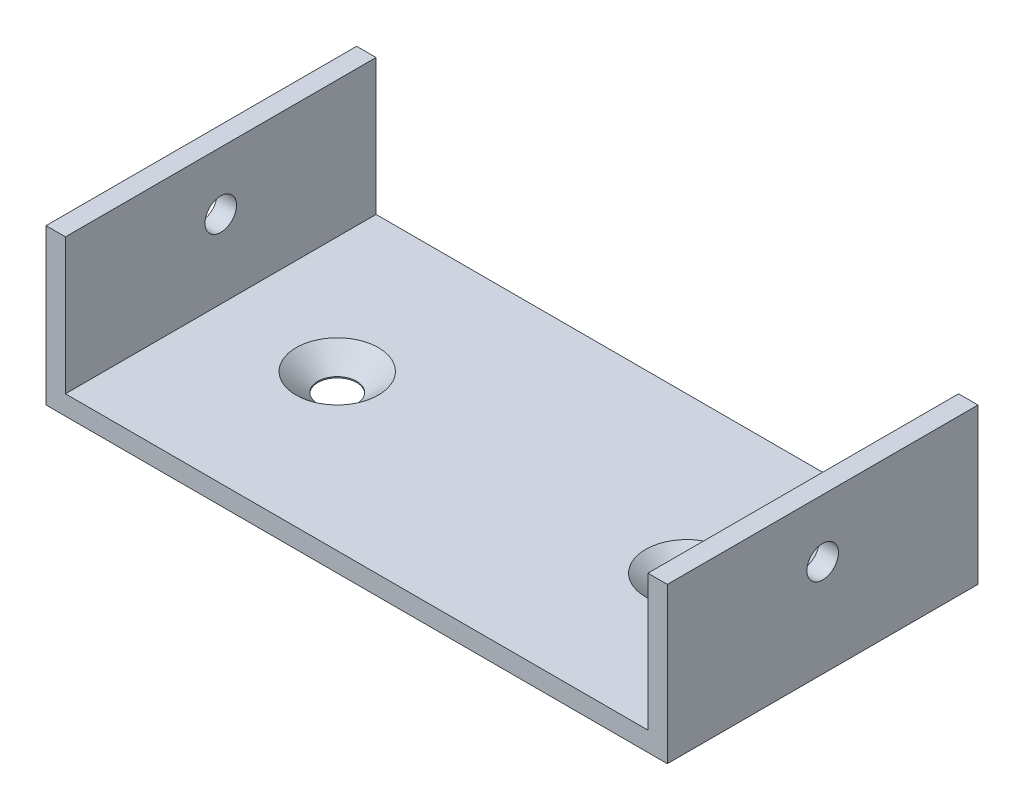
ISO-10303-21;
HEADER;
FILE_DESCRIPTION(('STEP AP214'),'2;1');
FILE_NAME('part.step','',(''),(''),'','','');
FILE_SCHEMA(('AUTOMOTIVE_DESIGN { 1 0 10303 214 1 1 1 1 }'));
ENDSEC;
DATA;
#1=APPLICATION_CONTEXT('core data for automotive mechanical design processes');
#2=APPLICATION_PROTOCOL_DEFINITION('international standard','automotive_design',2000,#1);
#3=PRODUCT_CONTEXT('',#1,'mechanical');
#4=PRODUCT('Part','Part','',(#3));
#5=PRODUCT_RELATED_PRODUCT_CATEGORY('part','',(#4));
#6=PRODUCT_DEFINITION_FORMATION('','',#4);
#7=PRODUCT_DEFINITION_CONTEXT('part definition',#1,'design');
#8=PRODUCT_DEFINITION('design','',#6,#7);
#9=PRODUCT_DEFINITION_SHAPE('','',#8);
#10=(LENGTH_UNIT() NAMED_UNIT(*) SI_UNIT(.MILLI.,.METRE.));
#11=(NAMED_UNIT(*) PLANE_ANGLE_UNIT() SI_UNIT($,.RADIAN.));
#12=(NAMED_UNIT(*) SI_UNIT($,.STERADIAN.) SOLID_ANGLE_UNIT());
#13=UNCERTAINTY_MEASURE_WITH_UNIT(LENGTH_MEASURE(1.E-05),#10,'distance_accuracy_value','');
#14=(GEOMETRIC_REPRESENTATION_CONTEXT(3) GLOBAL_UNCERTAINTY_ASSIGNED_CONTEXT((#13)) GLOBAL_UNIT_ASSIGNED_CONTEXT((#10,
#11,#12)) REPRESENTATION_CONTEXT('',''));
#15=CARTESIAN_POINT('',(0.,0.,0.));
#16=DIRECTION('',(0.,0.,1.));
#17=DIRECTION('',(1.,0.,0.));
#18=AXIS2_PLACEMENT_3D('',#15,#16,#17);
#19=CARTESIAN_POINT('',(-47.625,12.7,25.4));
#20=DIRECTION('',(0.,-1.,0.));
#21=DIRECTION('',(1.,0.,0.));
#22=AXIS2_PLACEMENT_3D('',#19,#20,#21);
#23=PLANE('',#22);
#24=DIRECTION('',(-1.,0.,0.));
#25=VECTOR('',#24,1.);
#26=CARTESIAN_POINT('',(-47.625,12.7,-25.4));
#27=LINE('',#26,#25);
#28=CARTESIAN_POINT('',(-47.625,12.7,-25.4));
#29=VERTEX_POINT('',#28);
#30=CARTESIAN_POINT('',(-50.8,12.7,-25.4));
#31=VERTEX_POINT('',#30);
#32=EDGE_CURVE('E147',#29,#31,#27,.T.);
#33=ORIENTED_EDGE('',*,*,#32,.T.);
#34=DIRECTION('',(0.,0.,-1.));
#35=VECTOR('',#34,1.);
#36=CARTESIAN_POINT('',(-50.8,12.7,25.4));
#37=LINE('',#36,#35);
#38=CARTESIAN_POINT('',(-50.8,12.7,25.4));
#39=VERTEX_POINT('',#38);
#40=EDGE_CURVE('E11',#39,#31,#37,.T.);
#41=ORIENTED_EDGE('',*,*,#40,.F.);
#42=DIRECTION('',(-1.,0.,0.));
#43=VECTOR('',#42,1.);
#44=CARTESIAN_POINT('',(-47.625,12.7,25.4));
#45=LINE('',#44,#43);
#46=CARTESIAN_POINT('',(-47.625,12.7,25.4));
#47=VERTEX_POINT('',#46);
#48=EDGE_CURVE('E170',#47,#39,#45,.T.);
#49=ORIENTED_EDGE('',*,*,#48,.F.);
#50=DIRECTION('',(0.,0.,-1.));
#51=VECTOR('',#50,1.);
#52=CARTESIAN_POINT('',(-47.625,12.7,25.4));
#53=LINE('',#52,#51);
#54=EDGE_CURVE('E143',#47,#29,#53,.T.);
#55=ORIENTED_EDGE('',*,*,#54,.T.);
#56=EDGE_LOOP('',(#33,#41,#49,#55));
#57=FACE_BOUND('',#56,.T.);
#58=ADVANCED_FACE('F44',(#57),#23,.F.);
#59=CARTESIAN_POINT('',(-50.8,12.7,25.4));
#60=DIRECTION('',(1.,0.,0.));
#61=DIRECTION('',(0.,0.,-1.));
#62=AXIS2_PLACEMENT_3D('',#59,#60,#61);
#63=PLANE('',#62);
#64=CARTESIAN_POINT('',(-50.8,3.21584337728158,0.));
#65=DIRECTION('',(1.,0.,0.));
#66=DIRECTION('',(0.,0.,-1.));
#67=AXIS2_PLACEMENT_3D('',#64,#65,#66);
#68=CIRCLE('',#67,2.57975099999998);
#69=CARTESIAN_POINT('',(-50.8,3.21584337728158,-2.57975099999998));
#70=VERTEX_POINT('',#69);
#71=EDGE_CURVE('E244',#70,#70,#68,.T.);
#72=ORIENTED_EDGE('',*,*,#71,.T.);
#73=EDGE_LOOP('',(#72));
#74=FACE_BOUND('',#73,.T.);
#75=DIRECTION('',(0.,-1.,0.));
#76=VECTOR('',#75,1.);
#77=CARTESIAN_POINT('',(-50.8,12.7,-25.4));
#78=LINE('',#77,#76);
#79=CARTESIAN_POINT('',(-50.8,-12.7,-25.4));
#80=VERTEX_POINT('',#79);
#81=EDGE_CURVE('E151',#31,#80,#78,.T.);
#82=ORIENTED_EDGE('',*,*,#81,.T.);
#83=DIRECTION('',(0.,0.,-1.));
#84=VECTOR('',#83,1.);
#85=CARTESIAN_POINT('',(-50.8,-12.7,25.4));
#86=LINE('',#85,#84);
#87=CARTESIAN_POINT('',(-50.8,-12.7,25.4));
#88=VERTEX_POINT('',#87);
#89=EDGE_CURVE('E54',#88,#80,#86,.T.);
#90=ORIENTED_EDGE('',*,*,#89,.F.);
#91=DIRECTION('',(0.,-1.,0.));
#92=VECTOR('',#91,1.);
#93=CARTESIAN_POINT('',(-50.8,12.7,25.4));
#94=LINE('',#93,#92);
#95=EDGE_CURVE('E105',#39,#88,#94,.T.);
#96=ORIENTED_EDGE('',*,*,#95,.F.);
#97=ORIENTED_EDGE('',*,*,#40,.T.);
#98=EDGE_LOOP('',(#82,#90,#96,#97));
#99=FACE_BOUND('',#98,.T.);
#100=ADVANCED_FACE('F264',(#74,#99),#63,.F.);
#101=CARTESIAN_POINT('',(-50.8,-12.7,25.4));
#102=DIRECTION('',(0.,1.,0.));
#103=DIRECTION('',(0.,0.,1.));
#104=AXIS2_PLACEMENT_3D('',#101,#102,#103);
#105=PLANE('',#104);
#106=CARTESIAN_POINT('',(-28.575,-12.7,0.));
#107=DIRECTION('',(0.,1.,0.));
#108=DIRECTION('',(0.,0.,1.));
#109=AXIS2_PLACEMENT_3D('',#106,#107,#108);
#110=CIRCLE('',#109,3.17499999999999);
#111=CARTESIAN_POINT('',(-28.575,-12.7,3.17499999999999));
#112=VERTEX_POINT('',#111);
#113=EDGE_CURVE('E228',#112,#112,#110,.T.);
#114=ORIENTED_EDGE('',*,*,#113,.T.);
#115=EDGE_LOOP('',(#114));
#116=FACE_BOUND('',#115,.T.);
#117=CARTESIAN_POINT('',(28.575,-12.7,0.));
#118=DIRECTION('',(0.,1.,0.));
#119=DIRECTION('',(0.,0.,1.));
#120=AXIS2_PLACEMENT_3D('',#117,#118,#119);
#121=CIRCLE('',#120,3.17499999999999);
#122=CARTESIAN_POINT('',(28.575,-12.7,3.175));
#123=VERTEX_POINT('',#122);
#124=EDGE_CURVE('E152',#123,#123,#121,.T.);
#125=ORIENTED_EDGE('',*,*,#124,.T.);
#126=EDGE_LOOP('',(#125));
#127=FACE_BOUND('',#126,.T.);
#128=DIRECTION('',(1.,0.,0.));
#129=VECTOR('',#128,1.);
#130=CARTESIAN_POINT('',(-50.8,-12.7,-25.4));
#131=LINE('',#130,#129);
#132=CARTESIAN_POINT('',(50.8,-12.7,-25.4));
#133=VERTEX_POINT('',#132);
#134=EDGE_CURVE('E155',#80,#133,#131,.T.);
#135=ORIENTED_EDGE('',*,*,#134,.T.);
#136=DIRECTION('',(0.,0.,-1.));
#137=VECTOR('',#136,1.);
#138=CARTESIAN_POINT('',(50.8,-12.7,25.4));
#139=LINE('',#138,#137);
#140=CARTESIAN_POINT('',(50.8,-12.7,25.4));
#141=VERTEX_POINT('',#140);
#142=EDGE_CURVE('E181',#141,#133,#139,.T.);
#143=ORIENTED_EDGE('',*,*,#142,.F.);
#144=DIRECTION('',(1.,0.,0.));
#145=VECTOR('',#144,1.);
#146=CARTESIAN_POINT('',(-50.8,-12.7,25.4));
#147=LINE('',#146,#145);
#148=EDGE_CURVE('E193',#88,#141,#147,.T.);
#149=ORIENTED_EDGE('',*,*,#148,.F.);
#150=ORIENTED_EDGE('',*,*,#89,.T.);
#151=EDGE_LOOP('',(#135,#143,#149,#150));
#152=FACE_BOUND('',#151,.T.);
#153=ADVANCED_FACE('F191',(#116,#127,#152),#105,.F.);
#154=CARTESIAN_POINT('',(50.8,-12.7,25.4));
#155=DIRECTION('',(-1.,0.,0.));
#156=DIRECTION('',(0.,0.,1.));
#157=AXIS2_PLACEMENT_3D('',#154,#155,#156);
#158=PLANE('',#157);
#159=CARTESIAN_POINT('',(50.8,3.21584337728158,0.));
#160=DIRECTION('',(1.,0.,0.));
#161=DIRECTION('',(0.,0.,-1.));
#162=AXIS2_PLACEMENT_3D('',#159,#160,#161);
#163=CIRCLE('',#162,2.57975099999999);
#164=CARTESIAN_POINT('',(50.8,3.21584337728158,-2.57975099999999));
#165=VERTEX_POINT('',#164);
#166=EDGE_CURVE('E248',#165,#165,#163,.T.);
#167=ORIENTED_EDGE('',*,*,#166,.F.);
#168=EDGE_LOOP('',(#167));
#169=FACE_BOUND('',#168,.T.);
#170=DIRECTION('',(0.,1.,0.));
#171=VECTOR('',#170,1.);
#172=CARTESIAN_POINT('',(50.8,-12.7,-25.4));
#173=LINE('',#172,#171);
#174=CARTESIAN_POINT('',(50.8,12.7,-25.4));
#175=VERTEX_POINT('',#174);
#176=EDGE_CURVE('E158',#133,#175,#173,.T.);
#177=ORIENTED_EDGE('',*,*,#176,.T.);
#178=DIRECTION('',(0.,0.,-1.));
#179=VECTOR('',#178,1.);
#180=CARTESIAN_POINT('',(50.8,12.7,25.4));
#181=LINE('',#180,#179);
#182=CARTESIAN_POINT('',(50.8,12.7,25.4));
#183=VERTEX_POINT('',#182);
#184=EDGE_CURVE('E177',#183,#175,#181,.T.);
#185=ORIENTED_EDGE('',*,*,#184,.F.);
#186=DIRECTION('',(0.,1.,0.));
#187=VECTOR('',#186,1.);
#188=CARTESIAN_POINT('',(50.8,-12.7,25.4));
#189=LINE('',#188,#187);
#190=EDGE_CURVE('E206',#141,#183,#189,.T.);
#191=ORIENTED_EDGE('',*,*,#190,.F.);
#192=ORIENTED_EDGE('',*,*,#142,.T.);
#193=EDGE_LOOP('',(#177,#185,#191,#192));
#194=FACE_BOUND('',#193,.T.);
#195=ADVANCED_FACE('F201',(#169,#194),#158,.F.);
#196=CARTESIAN_POINT('',(50.8,12.7,25.4));
#197=DIRECTION('',(0.,-1.,0.));
#198=DIRECTION('',(1.,0.,0.));
#199=AXIS2_PLACEMENT_3D('',#196,#197,#198);
#200=PLANE('',#199);
#201=DIRECTION('',(-1.,0.,0.));
#202=VECTOR('',#201,1.);
#203=CARTESIAN_POINT('',(50.8,12.7,-25.4));
#204=LINE('',#203,#202);
#205=CARTESIAN_POINT('',(47.625,12.7,-25.4));
#206=VERTEX_POINT('',#205);
#207=EDGE_CURVE('E161',#175,#206,#204,.T.);
#208=ORIENTED_EDGE('',*,*,#207,.T.);
#209=DIRECTION('',(0.,0.,-1.));
#210=VECTOR('',#209,1.);
#211=CARTESIAN_POINT('',(47.625,12.7,25.4));
#212=LINE('',#211,#210);
#213=CARTESIAN_POINT('',(47.625,12.7,25.4));
#214=VERTEX_POINT('',#213);
#215=EDGE_CURVE('E135',#214,#206,#212,.T.);
#216=ORIENTED_EDGE('',*,*,#215,.F.);
#217=DIRECTION('',(-1.,0.,0.));
#218=VECTOR('',#217,1.);
#219=CARTESIAN_POINT('',(50.8,12.7,25.4));
#220=LINE('',#219,#218);
#221=EDGE_CURVE('E124',#183,#214,#220,.T.);
#222=ORIENTED_EDGE('',*,*,#221,.F.);
#223=ORIENTED_EDGE('',*,*,#184,.T.);
#224=EDGE_LOOP('',(#208,#216,#222,#223));
#225=FACE_BOUND('',#224,.T.);
#226=ADVANCED_FACE('F204',(#225),#200,.F.);
#227=CARTESIAN_POINT('',(47.625,12.7,25.4));
#228=DIRECTION('',(1.,0.,0.));
#229=DIRECTION('',(0.,0.,-1.));
#230=AXIS2_PLACEMENT_3D('',#227,#228,#229);
#231=PLANE('',#230);
#232=CARTESIAN_POINT('',(47.625,3.21584337728158,0.));
#233=DIRECTION('',(1.,0.,0.));
#234=DIRECTION('',(0.,0.,-1.));
#235=AXIS2_PLACEMENT_3D('',#232,#233,#234);
#236=CIRCLE('',#235,2.57975099999998);
#237=CARTESIAN_POINT('',(47.625,3.21584337728158,-2.57975099999998));
#238=VERTEX_POINT('',#237);
#239=EDGE_CURVE('E240',#238,#238,#236,.T.);
#240=ORIENTED_EDGE('',*,*,#239,.T.);
#241=EDGE_LOOP('',(#240));
#242=FACE_BOUND('',#241,.T.);
#243=DIRECTION('',(0.,-1.,0.));
#244=VECTOR('',#243,1.);
#245=CARTESIAN_POINT('',(47.625,12.7,-25.4));
#246=LINE('',#245,#244);
#247=CARTESIAN_POINT('',(47.625,-9.525,-25.4));
#248=VERTEX_POINT('',#247);
#249=EDGE_CURVE('E133',#206,#248,#246,.T.);
#250=ORIENTED_EDGE('',*,*,#249,.T.);
#251=DIRECTION('',(0.,0.,-1.));
#252=VECTOR('',#251,1.);
#253=CARTESIAN_POINT('',(47.625,-9.525,25.4));
#254=LINE('',#253,#252);
#255=CARTESIAN_POINT('',(47.625,-9.525,25.4));
#256=VERTEX_POINT('',#255);
#257=EDGE_CURVE('E130',#256,#248,#254,.T.);
#258=ORIENTED_EDGE('',*,*,#257,.F.);
#259=DIRECTION('',(0.,-1.,0.));
#260=VECTOR('',#259,1.);
#261=CARTESIAN_POINT('',(47.625,12.7,25.4));
#262=LINE('',#261,#260);
#263=EDGE_CURVE('E118',#214,#256,#262,.T.);
#264=ORIENTED_EDGE('',*,*,#263,.F.);
#265=ORIENTED_EDGE('',*,*,#215,.T.);
#266=EDGE_LOOP('',(#250,#258,#264,#265));
#267=FACE_BOUND('',#266,.T.);
#268=ADVANCED_FACE('F131',(#242,#267),#231,.F.);
#269=CARTESIAN_POINT('',(47.625,-9.525,25.4));
#270=DIRECTION('',(0.,-1.,0.));
#271=DIRECTION('',(1.,0.,0.));
#272=AXIS2_PLACEMENT_3D('',#269,#270,#271);
#273=PLANE('',#272);
#274=CARTESIAN_POINT('',(-28.575,-9.52500000000001,0.));
#275=DIRECTION('',(0.,1.,0.));
#276=DIRECTION('',(0.,0.,1.));
#277=AXIS2_PLACEMENT_3D('',#274,#275,#276);
#278=CIRCLE('',#277,6.731);
#279=CARTESIAN_POINT('',(-28.575,-9.52500000000001,6.731));
#280=VERTEX_POINT('',#279);
#281=EDGE_CURVE('E236',#280,#280,#278,.T.);
#282=ORIENTED_EDGE('',*,*,#281,.F.);
#283=EDGE_LOOP('',(#282));
#284=FACE_BOUND('',#283,.T.);
#285=CARTESIAN_POINT('',(28.575,-9.525,0.));
#286=DIRECTION('',(0.,1.,0.));
#287=DIRECTION('',(0.,0.,1.));
#288=AXIS2_PLACEMENT_3D('',#285,#286,#287);
#289=CIRCLE('',#288,6.731);
#290=CARTESIAN_POINT('',(28.575,-9.525,6.731));
#291=VERTEX_POINT('',#290);
#292=EDGE_CURVE('E224',#291,#291,#289,.T.);
#293=ORIENTED_EDGE('',*,*,#292,.F.);
#294=EDGE_LOOP('',(#293));
#295=FACE_BOUND('',#294,.T.);
#296=DIRECTION('',(-1.,0.,0.));
#297=VECTOR('',#296,1.);
#298=CARTESIAN_POINT('',(47.625,-9.525,-25.4));
#299=LINE('',#298,#297);
#300=CARTESIAN_POINT('',(-47.625,-9.52500000000001,-25.4));
#301=VERTEX_POINT('',#300);
#302=EDGE_CURVE('E91',#248,#301,#299,.T.);
#303=ORIENTED_EDGE('',*,*,#302,.T.);
#304=DIRECTION('',(0.,0.,-1.));
#305=VECTOR('',#304,1.);
#306=CARTESIAN_POINT('',(-47.625,-9.52500000000001,25.4));
#307=LINE('',#306,#305);
#308=CARTESIAN_POINT('',(-47.625,-9.52500000000001,25.4));
#309=VERTEX_POINT('',#308);
#310=EDGE_CURVE('E136',#309,#301,#307,.T.);
#311=ORIENTED_EDGE('',*,*,#310,.F.);
#312=DIRECTION('',(-1.,0.,0.));
#313=VECTOR('',#312,1.);
#314=CARTESIAN_POINT('',(47.625,-9.525,25.4));
#315=LINE('',#314,#313);
#316=EDGE_CURVE('E122',#256,#309,#315,.T.);
#317=ORIENTED_EDGE('',*,*,#316,.F.);
#318=ORIENTED_EDGE('',*,*,#257,.T.);
#319=EDGE_LOOP('',(#303,#311,#317,#318));
#320=FACE_BOUND('',#319,.T.);
#321=ADVANCED_FACE('F138',(#284,#295,#320),#273,.F.);
#322=CARTESIAN_POINT('',(-47.625,-9.52500000000001,25.4));
#323=DIRECTION('',(-1.,0.,0.));
#324=DIRECTION('',(0.,0.,1.));
#325=AXIS2_PLACEMENT_3D('',#322,#323,#324);
#326=PLANE('',#325);
#327=CARTESIAN_POINT('',(-47.625,3.21584337728158,0.));
#328=DIRECTION('',(-1.,0.,0.));
#329=DIRECTION('',(0.,0.,1.));
#330=AXIS2_PLACEMENT_3D('',#327,#328,#329);
#331=CIRCLE('',#330,2.57975099999998);
#332=CARTESIAN_POINT('',(-47.625,3.21584337728158,2.57975099999998));
#333=VERTEX_POINT('',#332);
#334=EDGE_CURVE('E47',#333,#333,#331,.T.);
#335=ORIENTED_EDGE('',*,*,#334,.T.);
#336=EDGE_LOOP('',(#335));
#337=FACE_BOUND('',#336,.T.);
#338=DIRECTION('',(0.,1.,0.));
#339=VECTOR('',#338,1.);
#340=CARTESIAN_POINT('',(-47.625,-9.52500000000001,-25.4));
#341=LINE('',#340,#339);
#342=EDGE_CURVE('E97',#301,#29,#341,.T.);
#343=ORIENTED_EDGE('',*,*,#342,.T.);
#344=ORIENTED_EDGE('',*,*,#54,.F.);
#345=DIRECTION('',(0.,1.,0.));
#346=VECTOR('',#345,1.);
#347=CARTESIAN_POINT('',(-47.625,-9.52500000000001,25.4));
#348=LINE('',#347,#346);
#349=EDGE_CURVE('E62',#309,#47,#348,.T.);
#350=ORIENTED_EDGE('',*,*,#349,.F.);
#351=ORIENTED_EDGE('',*,*,#310,.T.);
#352=EDGE_LOOP('',(#343,#344,#350,#351));
#353=FACE_BOUND('',#352,.T.);
#354=ADVANCED_FACE('F275',(#337,#353),#326,.F.);
#355=CARTESIAN_POINT('',(0.,0.,25.4));
#356=DIRECTION('',(0.,0.,1.));
#357=DIRECTION('',(1.,0.,0.));
#358=AXIS2_PLACEMENT_3D('',#355,#356,#357);
#359=PLANE('',#358);
#360=ORIENTED_EDGE('',*,*,#48,.T.);
#361=ORIENTED_EDGE('',*,*,#95,.T.);
#362=ORIENTED_EDGE('',*,*,#148,.T.);
#363=ORIENTED_EDGE('',*,*,#190,.T.);
#364=ORIENTED_EDGE('',*,*,#221,.T.);
#365=ORIENTED_EDGE('',*,*,#263,.T.);
#366=ORIENTED_EDGE('',*,*,#316,.T.);
#367=ORIENTED_EDGE('',*,*,#349,.T.);
#368=EDGE_LOOP('',(#360,#361,#362,#363,#364,#365,#366,#367));
#369=FACE_BOUND('',#368,.T.);
#370=ADVANCED_FACE('F120',(#369),#359,.T.);
#371=CARTESIAN_POINT('',(0.,0.,-25.4));
#372=DIRECTION('',(0.,0.,1.));
#373=DIRECTION('',(1.,0.,0.));
#374=AXIS2_PLACEMENT_3D('',#371,#372,#373);
#375=PLANE('',#374);
#376=ORIENTED_EDGE('',*,*,#32,.F.);
#377=ORIENTED_EDGE('',*,*,#342,.F.);
#378=ORIENTED_EDGE('',*,*,#302,.F.);
#379=ORIENTED_EDGE('',*,*,#249,.F.);
#380=ORIENTED_EDGE('',*,*,#207,.F.);
#381=ORIENTED_EDGE('',*,*,#176,.F.);
#382=ORIENTED_EDGE('',*,*,#134,.F.);
#383=ORIENTED_EDGE('',*,*,#81,.F.);
#384=EDGE_LOOP('',(#376,#377,#378,#379,#380,#381,#382,#383));
#385=FACE_BOUND('',#384,.T.);
#386=ADVANCED_FACE('F197',(#385),#375,.F.);
#387=CARTESIAN_POINT('',(28.575,-9.525,0.));
#388=DIRECTION('',(0.,1.,0.));
#389=DIRECTION('',(0.,0.,1.));
#390=AXIS2_PLACEMENT_3D('',#387,#388,#389);
#391=CYLINDRICAL_SURFACE('',#390,3.175);
#392=ORIENTED_EDGE('',*,*,#124,.F.);
#393=EDGE_LOOP('',(#392));
#394=FACE_BOUND('',#393,.T.);
#395=CARTESIAN_POINT('',(28.575,-12.5088382884664,0.));
#396=DIRECTION('',(0.,1.,0.));
#397=DIRECTION('',(0.,0.,1.));
#398=AXIS2_PLACEMENT_3D('',#395,#396,#397);
#399=CIRCLE('',#398,3.175);
#400=CARTESIAN_POINT('',(28.575,-12.5088382884664,3.175));
#401=VERTEX_POINT('',#400);
#402=EDGE_CURVE('E220',#401,#401,#399,.T.);
#403=ORIENTED_EDGE('',*,*,#402,.T.);
#404=EDGE_LOOP('',(#403));
#405=FACE_BOUND('',#404,.T.);
#406=ADVANCED_FACE('F313',(#394,#405),#391,.F.);
#407=CARTESIAN_POINT('',(28.575,-9.525,0.));
#408=DIRECTION('',(0.,1.,0.));
#409=DIRECTION('',(0.,0.,1.));
#410=AXIS2_PLACEMENT_3D('',#407,#408,#409);
#411=CONICAL_SURFACE('',#410,6.731,0.872664625997164);
#412=ORIENTED_EDGE('',*,*,#402,.F.);
#413=EDGE_LOOP('',(#412));
#414=FACE_BOUND('',#413,.T.);
#415=ORIENTED_EDGE('',*,*,#292,.T.);
#416=EDGE_LOOP('',(#415));
#417=FACE_BOUND('',#416,.T.);
#418=ADVANCED_FACE('F309',(#414,#417),#411,.F.);
#419=CARTESIAN_POINT('',(-28.575,-9.52500000000001,0.));
#420=DIRECTION('',(0.,1.,0.));
#421=DIRECTION('',(0.,0.,1.));
#422=AXIS2_PLACEMENT_3D('',#419,#420,#421);
#423=CYLINDRICAL_SURFACE('',#422,3.175);
#424=ORIENTED_EDGE('',*,*,#113,.F.);
#425=EDGE_LOOP('',(#424));
#426=FACE_BOUND('',#425,.T.);
#427=CARTESIAN_POINT('',(-28.575,-12.5088382884664,0.));
#428=DIRECTION('',(0.,1.,0.));
#429=DIRECTION('',(0.,0.,1.));
#430=AXIS2_PLACEMENT_3D('',#427,#428,#429);
#431=CIRCLE('',#430,3.175);
#432=CARTESIAN_POINT('',(-28.575,-12.5088382884664,3.175));
#433=VERTEX_POINT('',#432);
#434=EDGE_CURVE('E232',#433,#433,#431,.T.);
#435=ORIENTED_EDGE('',*,*,#434,.T.);
#436=EDGE_LOOP('',(#435));
#437=FACE_BOUND('',#436,.T.);
#438=ADVANCED_FACE('F305',(#426,#437),#423,.F.);
#439=CARTESIAN_POINT('',(-28.575,-9.52500000000001,0.));
#440=DIRECTION('',(0.,1.,0.));
#441=DIRECTION('',(0.,0.,1.));
#442=AXIS2_PLACEMENT_3D('',#439,#440,#441);
#443=CONICAL_SURFACE('',#442,6.731,0.872664625997165);
#444=ORIENTED_EDGE('',*,*,#434,.F.);
#445=EDGE_LOOP('',(#444));
#446=FACE_BOUND('',#445,.T.);
#447=ORIENTED_EDGE('',*,*,#281,.T.);
#448=EDGE_LOOP('',(#447));
#449=FACE_BOUND('',#448,.T.);
#450=ADVANCED_FACE('F300',(#446,#449),#443,.F.);
#451=CARTESIAN_POINT('',(50.8,3.21584337728158,0.));
#452=DIRECTION('',(1.,0.,0.));
#453=DIRECTION('',(0.,0.,-1.));
#454=AXIS2_PLACEMENT_3D('',#451,#452,#453);
#455=CYLINDRICAL_SURFACE('',#454,2.57975099999998);
#456=ORIENTED_EDGE('',*,*,#71,.F.);
#457=EDGE_LOOP('',(#456));
#458=FACE_BOUND('',#457,.T.);
#459=ORIENTED_EDGE('',*,*,#334,.F.);
#460=EDGE_LOOP('',(#459));
#461=FACE_BOUND('',#460,.T.);
#462=ADVANCED_FACE('F295',(#458,#461),#455,.F.);
#463=ORIENTED_EDGE('',*,*,#166,.T.);
#464=EDGE_LOOP('',(#463));
#465=FACE_BOUND('',#464,.T.);
#466=ORIENTED_EDGE('',*,*,#239,.F.);
#467=EDGE_LOOP('',(#466));
#468=FACE_BOUND('',#467,.T.);
#469=ADVANCED_FACE('F254',(#465,#468),#455,.F.);
#470=CLOSED_SHELL('',(#58,#100,#153,#195,#226,#268,#321,#354,#370,#386,#406,#418,#438,#450,#462,#469));
#471=MANIFOLD_SOLID_BREP('B2',#470);
#472=ADVANCED_BREP_SHAPE_REPRESENTATION('',(#18,#471),#14);
#473=SHAPE_DEFINITION_REPRESENTATION(#9,#472);
ENDSEC;
END-ISO-10303-21;
